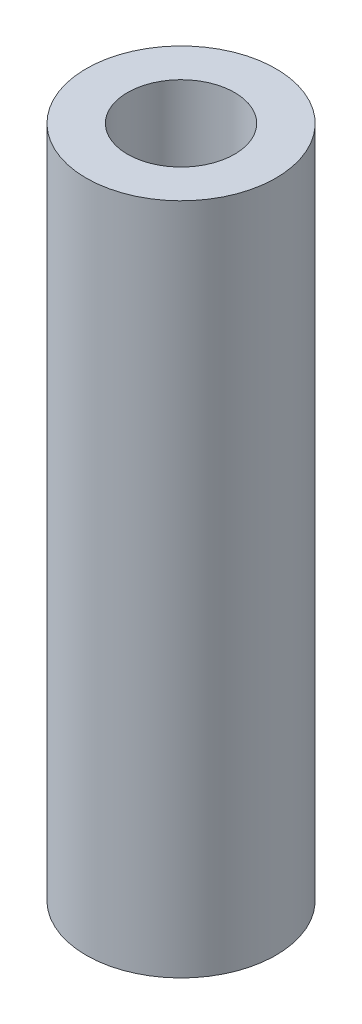
ISO-10303-21;
HEADER;
FILE_DESCRIPTION(('STEP AP214'),'2;1');
FILE_NAME('part.step','',(''),(''),'','','');
FILE_SCHEMA(('AUTOMOTIVE_DESIGN { 1 0 10303 214 1 1 1 1 }'));
ENDSEC;
DATA;
#1=APPLICATION_CONTEXT('core data for automotive mechanical design processes');
#2=APPLICATION_PROTOCOL_DEFINITION('international standard','automotive_design',2000,#1);
#3=PRODUCT_CONTEXT('',#1,'mechanical');
#4=PRODUCT('Part','Part','',(#3));
#5=PRODUCT_RELATED_PRODUCT_CATEGORY('part','',(#4));
#6=PRODUCT_DEFINITION_FORMATION('','',#4);
#7=PRODUCT_DEFINITION_CONTEXT('part definition',#1,'design');
#8=PRODUCT_DEFINITION('design','',#6,#7);
#9=PRODUCT_DEFINITION_SHAPE('','',#8);
#10=(LENGTH_UNIT() NAMED_UNIT(*) SI_UNIT(.MILLI.,.METRE.));
#11=(NAMED_UNIT(*) PLANE_ANGLE_UNIT() SI_UNIT($,.RADIAN.));
#12=(NAMED_UNIT(*) SI_UNIT($,.STERADIAN.) SOLID_ANGLE_UNIT());
#13=UNCERTAINTY_MEASURE_WITH_UNIT(LENGTH_MEASURE(1.E-05),#10,'distance_accuracy_value','');
#14=(GEOMETRIC_REPRESENTATION_CONTEXT(3) GLOBAL_UNCERTAINTY_ASSIGNED_CONTEXT((#13)) GLOBAL_UNIT_ASSIGNED_CONTEXT((#10,
#11,#12)) REPRESENTATION_CONTEXT('',''));
#15=CARTESIAN_POINT('',(0.,0.,0.));
#16=DIRECTION('',(0.,0.,1.));
#17=DIRECTION('',(1.,0.,0.));
#18=AXIS2_PLACEMENT_3D('',#15,#16,#17);
#19=CARTESIAN_POINT('',(0.,344.744344028702,0.));
#20=DIRECTION('',(0.,1.,0.));
#21=DIRECTION('',(0.,0.,1.));
#22=AXIS2_PLACEMENT_3D('',#19,#20,#21);
#23=CYLINDRICAL_SURFACE('',#22,35.);
#24=CARTESIAN_POINT('',(0.,-220.,0.));
#25=DIRECTION('',(0.,1.,0.));
#26=DIRECTION('',(0.,0.,1.));
#27=AXIS2_PLACEMENT_3D('',#24,#25,#26);
#28=CIRCLE('',#27,35.);
#29=CARTESIAN_POINT('',(0.,-220.,35.));
#30=VERTEX_POINT('',#29);
#31=EDGE_CURVE('E10',#30,#30,#28,.T.);
#32=ORIENTED_EDGE('',*,*,#31,.F.);
#33=EDGE_LOOP('',(#32));
#34=FACE_BOUND('',#33,.T.);
#35=CARTESIAN_POINT('',(0.,220.,0.));
#36=DIRECTION('',(0.,1.,0.));
#37=DIRECTION('',(0.,0.,1.));
#38=AXIS2_PLACEMENT_3D('',#35,#36,#37);
#39=CIRCLE('',#38,35.);
#40=CARTESIAN_POINT('',(0.,220.,35.));
#41=VERTEX_POINT('',#40);
#42=EDGE_CURVE('E51',#41,#41,#39,.T.);
#43=ORIENTED_EDGE('',*,*,#42,.T.);
#44=EDGE_LOOP('',(#43));
#45=FACE_BOUND('',#44,.T.);
#46=ADVANCED_FACE('F37',(#34,#45),#23,.F.);
#47=CARTESIAN_POINT('',(35.,-220.,0.));
#48=DIRECTION('',(0.,1.,0.));
#49=DIRECTION('',(0.,0.,1.));
#50=AXIS2_PLACEMENT_3D('',#47,#48,#49);
#51=PLANE('',#50);
#52=CARTESIAN_POINT('',(0.,-220.,0.));
#53=DIRECTION('',(0.,1.,0.));
#54=DIRECTION('',(0.,0.,1.));
#55=AXIS2_PLACEMENT_3D('',#52,#53,#54);
#56=CIRCLE('',#55,62.);
#57=CARTESIAN_POINT('',(0.,-220.,62.));
#58=VERTEX_POINT('',#57);
#59=EDGE_CURVE('E43',#58,#58,#56,.T.);
#60=ORIENTED_EDGE('',*,*,#59,.F.);
#61=EDGE_LOOP('',(#60));
#62=FACE_BOUND('',#61,.T.);
#63=ORIENTED_EDGE('',*,*,#31,.T.);
#64=EDGE_LOOP('',(#63));
#65=FACE_BOUND('',#64,.T.);
#66=ADVANCED_FACE('F66',(#62,#65),#51,.F.);
#67=CARTESIAN_POINT('',(0.,344.744344028702,0.));
#68=DIRECTION('',(0.,1.,0.));
#69=DIRECTION('',(0.,0.,1.));
#70=AXIS2_PLACEMENT_3D('',#67,#68,#69);
#71=CYLINDRICAL_SURFACE('',#70,62.);
#72=CARTESIAN_POINT('',(0.,220.,0.));
#73=DIRECTION('',(0.,1.,0.));
#74=DIRECTION('',(0.,0.,1.));
#75=AXIS2_PLACEMENT_3D('',#72,#73,#74);
#76=CIRCLE('',#75,62.);
#77=CARTESIAN_POINT('',(0.,220.,62.));
#78=VERTEX_POINT('',#77);
#79=EDGE_CURVE('E47',#78,#78,#76,.T.);
#80=ORIENTED_EDGE('',*,*,#79,.F.);
#81=EDGE_LOOP('',(#80));
#82=FACE_BOUND('',#81,.T.);
#83=ORIENTED_EDGE('',*,*,#59,.T.);
#84=EDGE_LOOP('',(#83));
#85=FACE_BOUND('',#84,.T.);
#86=ADVANCED_FACE('F61',(#82,#85),#71,.T.);
#87=CARTESIAN_POINT('',(35.,220.,0.));
#88=DIRECTION('',(0.,-1.,0.));
#89=DIRECTION('',(0.,0.,-1.));
#90=AXIS2_PLACEMENT_3D('',#87,#88,#89);
#91=PLANE('',#90);
#92=ORIENTED_EDGE('',*,*,#42,.F.);
#93=EDGE_LOOP('',(#92));
#94=FACE_BOUND('',#93,.T.);
#95=ORIENTED_EDGE('',*,*,#79,.T.);
#96=EDGE_LOOP('',(#95));
#97=FACE_BOUND('',#96,.T.);
#98=ADVANCED_FACE('F58',(#94,#97),#91,.F.);
#99=CLOSED_SHELL('',(#46,#66,#86,#98));
#100=MANIFOLD_SOLID_BREP('B2',#99);
#101=ADVANCED_BREP_SHAPE_REPRESENTATION('',(#18,#100),#14);
#102=SHAPE_DEFINITION_REPRESENTATION(#9,#101);
ENDSEC;
END-ISO-10303-21;
